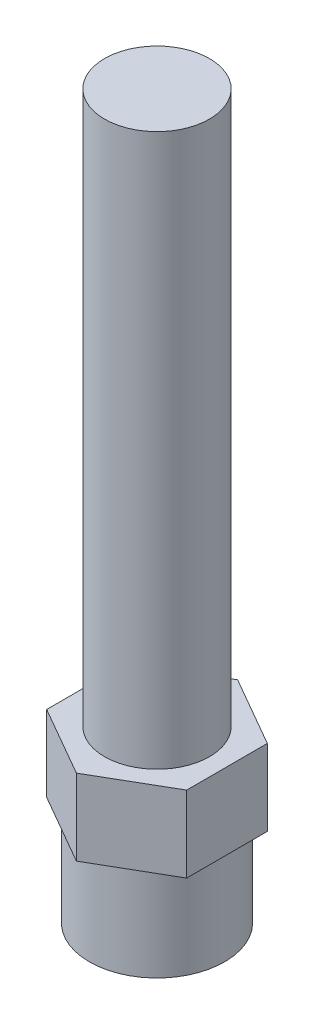
ISO-10303-21;
HEADER;
FILE_DESCRIPTION(('STEP AP214'),'2;1');
FILE_NAME('part.step','',(''),(''),'','','');
FILE_SCHEMA(('AUTOMOTIVE_DESIGN { 1 0 10303 214 1 1 1 1 }'));
ENDSEC;
DATA;
#1=APPLICATION_CONTEXT('core data for automotive mechanical design processes');
#2=APPLICATION_PROTOCOL_DEFINITION('international standard','automotive_design',2000,#1);
#3=PRODUCT_CONTEXT('',#1,'mechanical');
#4=PRODUCT('Part','Part','',(#3));
#5=PRODUCT_RELATED_PRODUCT_CATEGORY('part','',(#4));
#6=PRODUCT_DEFINITION_FORMATION('','',#4);
#7=PRODUCT_DEFINITION_CONTEXT('part definition',#1,'design');
#8=PRODUCT_DEFINITION('design','',#6,#7);
#9=PRODUCT_DEFINITION_SHAPE('','',#8);
#10=(LENGTH_UNIT() NAMED_UNIT(*) SI_UNIT(.MILLI.,.METRE.));
#11=(NAMED_UNIT(*) PLANE_ANGLE_UNIT() SI_UNIT($,.RADIAN.));
#12=(NAMED_UNIT(*) SI_UNIT($,.STERADIAN.) SOLID_ANGLE_UNIT());
#13=UNCERTAINTY_MEASURE_WITH_UNIT(LENGTH_MEASURE(1.E-05),#10,'distance_accuracy_value','');
#14=(GEOMETRIC_REPRESENTATION_CONTEXT(3) GLOBAL_UNCERTAINTY_ASSIGNED_CONTEXT((#13)) GLOBAL_UNIT_ASSIGNED_CONTEXT((#10,
#11,#12)) REPRESENTATION_CONTEXT('',''));
#15=CARTESIAN_POINT('',(0.,0.,0.));
#16=DIRECTION('',(0.,0.,1.));
#17=DIRECTION('',(1.,0.,0.));
#18=AXIS2_PLACEMENT_3D('',#15,#16,#17);
#19=CARTESIAN_POINT('',(0.,8.5,0.));
#20=DIRECTION('',(0.,-1.,0.));
#21=DIRECTION('',(0.,0.,-1.));
#22=AXIS2_PLACEMENT_3D('',#19,#20,#21);
#23=CYLINDRICAL_SURFACE('',#22,6.125);
#24=CARTESIAN_POINT('',(0.,8.5,0.));
#25=DIRECTION('',(0.,1.,0.));
#26=DIRECTION('',(0.,0.,1.));
#27=AXIS2_PLACEMENT_3D('',#24,#25,#26);
#28=CIRCLE('',#27,6.125);
#29=CARTESIAN_POINT('',(0.,8.5,6.125));
#30=VERTEX_POINT('',#29);
#31=EDGE_CURVE('E11',#30,#30,#28,.T.);
#32=ORIENTED_EDGE('',*,*,#31,.F.);
#33=EDGE_LOOP('',(#32));
#34=FACE_BOUND('',#33,.T.);
#35=CARTESIAN_POINT('',(0.,0.,0.));
#36=DIRECTION('',(0.,1.,0.));
#37=DIRECTION('',(0.,0.,1.));
#38=AXIS2_PLACEMENT_3D('',#35,#36,#37);
#39=CIRCLE('',#38,6.125);
#40=CARTESIAN_POINT('',(0.,0.,6.125));
#41=VERTEX_POINT('',#40);
#42=EDGE_CURVE('E35',#41,#41,#39,.T.);
#43=ORIENTED_EDGE('',*,*,#42,.T.);
#44=EDGE_LOOP('',(#43));
#45=FACE_BOUND('',#44,.T.);
#46=ADVANCED_FACE('F32',(#34,#45),#23,.T.);
#47=CARTESIAN_POINT('',(0.,0.,0.));
#48=DIRECTION('',(0.,1.,0.));
#49=DIRECTION('',(0.,0.,1.));
#50=AXIS2_PLACEMENT_3D('',#47,#48,#49);
#51=PLANE('',#50);
#52=ORIENTED_EDGE('',*,*,#42,.F.);
#53=EDGE_LOOP('',(#52));
#54=FACE_BOUND('',#53,.T.);
#55=ADVANCED_FACE('F141',(#54),#51,.F.);
#56=CARTESIAN_POINT('',(0.0110910701038025,15.4,7.30924599313527));
#57=DIRECTION('',(-0.501313532205408,0.,-0.865265706258914));
#58=DIRECTION('',(-0.865265706258914,0.,0.501313532205408));
#59=AXIS2_PLACEMENT_3D('',#56,#57,#58);
#60=PLANE('',#59);
#61=DIRECTION('',(0.865265706258914,0.,-0.501313532205408));
#62=VECTOR('',#61,1.);
#63=CARTESIAN_POINT('',(0.0110910701038025,8.5,7.30924599313527));
#64=LINE('',#63,#62);
#65=CARTESIAN_POINT('',(0.0110910701038025,8.5,7.30924599313527));
#66=VERTEX_POINT('',#65);
#67=CARTESIAN_POINT('',(6.33553824761666,8.5,3.64501784810258));
#68=VERTEX_POINT('',#67);
#69=EDGE_CURVE('E117',#66,#68,#64,.T.);
#70=ORIENTED_EDGE('',*,*,#69,.T.);
#71=DIRECTION('',(0.,-1.,0.));
#72=VECTOR('',#71,1.);
#73=CARTESIAN_POINT('',(6.33553824761666,15.4,3.64501784810258));
#74=LINE('',#73,#72);
#75=CARTESIAN_POINT('',(6.33553824761666,15.4,3.64501784810258));
#76=VERTEX_POINT('',#75);
#77=EDGE_CURVE('E135',#76,#68,#74,.T.);
#78=ORIENTED_EDGE('',*,*,#77,.F.);
#79=DIRECTION('',(0.865265706258914,0.,-0.501313532205408));
#80=VECTOR('',#79,1.);
#81=CARTESIAN_POINT('',(0.0110910701038025,15.4,7.30924599313527));
#82=LINE('',#81,#80);
#83=CARTESIAN_POINT('',(0.0110910701038025,15.4,7.30924599313527));
#84=VERTEX_POINT('',#83);
#85=EDGE_CURVE('E128',#84,#76,#82,.T.);
#86=ORIENTED_EDGE('',*,*,#85,.F.);
#87=DIRECTION('',(0.,-1.,0.));
#88=VECTOR('',#87,1.);
#89=CARTESIAN_POINT('',(0.0110910701038025,15.4,7.30924599313527));
#90=LINE('',#89,#88);
#91=EDGE_CURVE('E113',#84,#66,#90,.T.);
#92=ORIENTED_EDGE('',*,*,#91,.T.);
#93=EDGE_LOOP('',(#70,#78,#86,#92));
#94=FACE_BOUND('',#93,.T.);
#95=ADVANCED_FACE('F143',(#94),#60,.F.);
#96=CARTESIAN_POINT('',(6.33553824761666,15.4,3.64501784810258));
#97=DIRECTION('',(-0.999998848746407,0.,0.00151740102133469));
#98=DIRECTION('',(0.00151740102133469,0.,0.999998848746408));
#99=AXIS2_PLACEMENT_3D('',#96,#97,#98);
#100=PLANE('',#99);
#101=DIRECTION('',(-0.00151740102133469,0.,-0.999998848746408));
#102=VECTOR('',#101,1.);
#103=CARTESIAN_POINT('',(6.33553824761666,8.5,3.64501784810258));
#104=LINE('',#103,#102);
#105=CARTESIAN_POINT('',(6.32444717751286,8.5,-3.66422814503268));
#106=VERTEX_POINT('',#105);
#107=EDGE_CURVE('E120',#68,#106,#104,.T.);
#108=ORIENTED_EDGE('',*,*,#107,.T.);
#109=DIRECTION('',(0.,-1.,0.));
#110=VECTOR('',#109,1.);
#111=CARTESIAN_POINT('',(6.32444717751286,15.4,-3.66422814503268));
#112=LINE('',#111,#110);
#113=CARTESIAN_POINT('',(6.32444717751286,15.4,-3.66422814503268));
#114=VERTEX_POINT('',#113);
#115=EDGE_CURVE('E132',#114,#106,#112,.T.);
#116=ORIENTED_EDGE('',*,*,#115,.F.);
#117=DIRECTION('',(-0.00151740102133469,0.,-0.999998848746408));
#118=VECTOR('',#117,1.);
#119=CARTESIAN_POINT('',(6.33553824761666,15.4,3.64501784810258));
#120=LINE('',#119,#118);
#121=EDGE_CURVE('E86',#76,#114,#120,.T.);
#122=ORIENTED_EDGE('',*,*,#121,.F.);
#123=ORIENTED_EDGE('',*,*,#77,.T.);
#124=EDGE_LOOP('',(#108,#116,#122,#123));
#125=FACE_BOUND('',#124,.T.);
#126=ADVANCED_FACE('F148',(#125),#100,.F.);
#127=CARTESIAN_POINT('',(6.32444717751286,15.4,-3.66422814503268));
#128=DIRECTION('',(-0.498685316540999,0.,0.866783107280249));
#129=DIRECTION('',(0.866783107280249,0.,0.498685316540999));
#130=AXIS2_PLACEMENT_3D('',#127,#128,#129);
#131=PLANE('',#130);
#132=DIRECTION('',(-0.866783107280249,0.,-0.498685316540999));
#133=VECTOR('',#132,1.);
#134=CARTESIAN_POINT('',(6.32444717751286,8.5,-3.66422814503268));
#135=LINE('',#134,#133);
#136=CARTESIAN_POINT('',(-0.0110910701038051,8.5,-7.30924599313527));
#137=VERTEX_POINT('',#136);
#138=EDGE_CURVE('E123',#106,#137,#135,.T.);
#139=ORIENTED_EDGE('',*,*,#138,.T.);
#140=DIRECTION('',(0.,-1.,0.));
#141=VECTOR('',#140,1.);
#142=CARTESIAN_POINT('',(-0.0110910701038051,15.4,-7.30924599313527));
#143=LINE('',#142,#141);
#144=CARTESIAN_POINT('',(-0.0110910701038051,15.4,-7.30924599313527));
#145=VERTEX_POINT('',#144);
#146=EDGE_CURVE('E108',#145,#137,#143,.T.);
#147=ORIENTED_EDGE('',*,*,#146,.F.);
#148=DIRECTION('',(-0.866783107280249,0.,-0.498685316540999));
#149=VECTOR('',#148,1.);
#150=CARTESIAN_POINT('',(6.32444717751286,15.4,-3.66422814503268));
#151=LINE('',#150,#149);
#152=EDGE_CURVE('E99',#114,#145,#151,.T.);
#153=ORIENTED_EDGE('',*,*,#152,.F.);
#154=ORIENTED_EDGE('',*,*,#115,.T.);
#155=EDGE_LOOP('',(#139,#147,#153,#154));
#156=FACE_BOUND('',#155,.T.);
#157=ADVANCED_FACE('F155',(#156),#131,.F.);
#158=CARTESIAN_POINT('',(-0.0110910701038051,15.4,-7.30924599313527));
#159=DIRECTION('',(0.501313532205408,0.,0.865265706258914));
#160=DIRECTION('',(0.865265706258914,0.,-0.501313532205408));
#161=AXIS2_PLACEMENT_3D('',#158,#159,#160);
#162=PLANE('',#161);
#163=DIRECTION('',(-0.865265706258914,0.,0.501313532205408));
#164=VECTOR('',#163,1.);
#165=CARTESIAN_POINT('',(-0.0110910701038051,8.5,-7.30924599313527));
#166=LINE('',#165,#164);
#167=CARTESIAN_POINT('',(-6.33553824761666,8.5,-3.64501784810258));
#168=VERTEX_POINT('',#167);
#169=EDGE_CURVE('E107',#137,#168,#166,.T.);
#170=ORIENTED_EDGE('',*,*,#169,.T.);
#171=DIRECTION('',(0.,-1.,0.));
#172=VECTOR('',#171,1.);
#173=CARTESIAN_POINT('',(-6.33553824761666,15.4,-3.64501784810258));
#174=LINE('',#173,#172);
#175=CARTESIAN_POINT('',(-6.33553824761666,15.4,-3.64501784810258));
#176=VERTEX_POINT('',#175);
#177=EDGE_CURVE('E104',#176,#168,#174,.T.);
#178=ORIENTED_EDGE('',*,*,#177,.F.);
#179=DIRECTION('',(-0.865265706258914,0.,0.501313532205408));
#180=VECTOR('',#179,1.);
#181=CARTESIAN_POINT('',(-0.0110910701038051,15.4,-7.30924599313527));
#182=LINE('',#181,#180);
#183=EDGE_CURVE('E93',#145,#176,#182,.T.);
#184=ORIENTED_EDGE('',*,*,#183,.F.);
#185=ORIENTED_EDGE('',*,*,#146,.T.);
#186=EDGE_LOOP('',(#170,#178,#184,#185));
#187=FACE_BOUND('',#186,.T.);
#188=ADVANCED_FACE('F105',(#187),#162,.F.);
#189=CARTESIAN_POINT('',(-6.33553824761666,15.4,-3.64501784810258));
#190=DIRECTION('',(0.999998848746407,0.,-0.00151740102133469));
#191=DIRECTION('',(-0.00151740102133469,0.,-0.999998848746408));
#192=AXIS2_PLACEMENT_3D('',#189,#190,#191);
#193=PLANE('',#192);
#194=DIRECTION('',(0.00151740102133469,0.,0.999998848746407));
#195=VECTOR('',#194,1.);
#196=CARTESIAN_POINT('',(-6.33553824761666,8.5,-3.64501784810258));
#197=LINE('',#196,#195);
#198=CARTESIAN_POINT('',(-6.32444717751286,8.5,3.66422814503268));
#199=VERTEX_POINT('',#198);
#200=EDGE_CURVE('E71',#168,#199,#197,.T.);
#201=ORIENTED_EDGE('',*,*,#200,.T.);
#202=DIRECTION('',(0.,-1.,0.));
#203=VECTOR('',#202,1.);
#204=CARTESIAN_POINT('',(-6.32444717751286,15.4,3.66422814503268));
#205=LINE('',#204,#203);
#206=CARTESIAN_POINT('',(-6.32444717751286,15.4,3.66422814503268));
#207=VERTEX_POINT('',#206);
#208=EDGE_CURVE('E109',#207,#199,#205,.T.);
#209=ORIENTED_EDGE('',*,*,#208,.F.);
#210=DIRECTION('',(0.00151740102133469,0.,0.999998848746407));
#211=VECTOR('',#210,1.);
#212=CARTESIAN_POINT('',(-6.33553824761666,15.4,-3.64501784810258));
#213=LINE('',#212,#211);
#214=EDGE_CURVE('E97',#176,#207,#213,.T.);
#215=ORIENTED_EDGE('',*,*,#214,.F.);
#216=ORIENTED_EDGE('',*,*,#177,.T.);
#217=EDGE_LOOP('',(#201,#209,#215,#216));
#218=FACE_BOUND('',#217,.T.);
#219=ADVANCED_FACE('F111',(#218),#193,.F.);
#220=CARTESIAN_POINT('',(-6.32444717751286,15.4,3.66422814503268));
#221=DIRECTION('',(0.498685316541,0.,-0.866783107280249));
#222=DIRECTION('',(-0.866783107280249,0.,-0.498685316541));
#223=AXIS2_PLACEMENT_3D('',#220,#221,#222);
#224=PLANE('',#223);
#225=DIRECTION('',(0.866783107280249,0.,0.498685316541));
#226=VECTOR('',#225,1.);
#227=CARTESIAN_POINT('',(-6.32444717751286,8.5,3.66422814503268));
#228=LINE('',#227,#226);
#229=EDGE_CURVE('E77',#199,#66,#228,.T.);
#230=ORIENTED_EDGE('',*,*,#229,.T.);
#231=ORIENTED_EDGE('',*,*,#91,.F.);
#232=DIRECTION('',(0.866783107280249,0.,0.498685316541));
#233=VECTOR('',#232,1.);
#234=CARTESIAN_POINT('',(-6.32444717751286,15.4,3.66422814503268));
#235=LINE('',#234,#233);
#236=EDGE_CURVE('E48',#207,#84,#235,.T.);
#237=ORIENTED_EDGE('',*,*,#236,.F.);
#238=ORIENTED_EDGE('',*,*,#208,.T.);
#239=EDGE_LOOP('',(#230,#231,#237,#238));
#240=FACE_BOUND('',#239,.T.);
#241=ADVANCED_FACE('F163',(#240),#224,.F.);
#242=CARTESIAN_POINT('',(0.,15.4,0.));
#243=DIRECTION('',(0.,1.,0.));
#244=DIRECTION('',(0.,0.,1.));
#245=AXIS2_PLACEMENT_3D('',#242,#243,#244);
#246=PLANE('',#245);
#247=CARTESIAN_POINT('',(0.,15.4,0.));
#248=DIRECTION('',(0.,1.,0.));
#249=DIRECTION('',(0.,0.,1.));
#250=AXIS2_PLACEMENT_3D('',#247,#248,#249);
#251=CIRCLE('',#250,4.75);
#252=CARTESIAN_POINT('',(0.,15.4,4.75));
#253=VERTEX_POINT('',#252);
#254=EDGE_CURVE('E184',#253,#253,#251,.T.);
#255=ORIENTED_EDGE('',*,*,#254,.F.);
#256=EDGE_LOOP('',(#255));
#257=FACE_BOUND('',#256,.T.);
#258=ORIENTED_EDGE('',*,*,#85,.T.);
#259=ORIENTED_EDGE('',*,*,#121,.T.);
#260=ORIENTED_EDGE('',*,*,#152,.T.);
#261=ORIENTED_EDGE('',*,*,#183,.T.);
#262=ORIENTED_EDGE('',*,*,#214,.T.);
#263=ORIENTED_EDGE('',*,*,#236,.T.);
#264=EDGE_LOOP('',(#258,#259,#260,#261,#262,#263));
#265=FACE_BOUND('',#264,.T.);
#266=ADVANCED_FACE('F95',(#257,#265),#246,.T.);
#267=CARTESIAN_POINT('',(0.,8.5,0.));
#268=DIRECTION('',(0.,1.,0.));
#269=DIRECTION('',(0.,0.,1.));
#270=AXIS2_PLACEMENT_3D('',#267,#268,#269);
#271=PLANE('',#270);
#272=ORIENTED_EDGE('',*,*,#31,.T.);
#273=EDGE_LOOP('',(#272));
#274=FACE_BOUND('',#273,.T.);
#275=ORIENTED_EDGE('',*,*,#69,.F.);
#276=ORIENTED_EDGE('',*,*,#229,.F.);
#277=ORIENTED_EDGE('',*,*,#200,.F.);
#278=ORIENTED_EDGE('',*,*,#169,.F.);
#279=ORIENTED_EDGE('',*,*,#138,.F.);
#280=ORIENTED_EDGE('',*,*,#107,.F.);
#281=EDGE_LOOP('',(#275,#276,#277,#278,#279,#280));
#282=FACE_BOUND('',#281,.T.);
#283=ADVANCED_FACE('F166',(#274,#282),#271,.F.);
#284=CARTESIAN_POINT('',(0.,65.4,0.));
#285=DIRECTION('',(0.,-1.,0.));
#286=DIRECTION('',(0.,0.,-1.));
#287=AXIS2_PLACEMENT_3D('',#284,#285,#286);
#288=CYLINDRICAL_SURFACE('',#287,4.75);
#289=CARTESIAN_POINT('',(0.,65.4,0.));
#290=DIRECTION('',(0.,1.,0.));
#291=DIRECTION('',(0.,0.,1.));
#292=AXIS2_PLACEMENT_3D('',#289,#290,#291);
#293=CIRCLE('',#292,4.75);
#294=CARTESIAN_POINT('',(0.,65.4,4.75));
#295=VERTEX_POINT('',#294);
#296=EDGE_CURVE('E121',#295,#295,#293,.T.);
#297=ORIENTED_EDGE('',*,*,#296,.F.);
#298=EDGE_LOOP('',(#297));
#299=FACE_BOUND('',#298,.T.);
#300=ORIENTED_EDGE('',*,*,#254,.T.);
#301=EDGE_LOOP('',(#300));
#302=FACE_BOUND('',#301,.T.);
#303=ADVANCED_FACE('F169',(#299,#302),#288,.T.);
#304=CARTESIAN_POINT('',(0.,65.4,0.));
#305=DIRECTION('',(0.,1.,0.));
#306=DIRECTION('',(0.,0.,1.));
#307=AXIS2_PLACEMENT_3D('',#304,#305,#306);
#308=PLANE('',#307);
#309=ORIENTED_EDGE('',*,*,#296,.T.);
#310=EDGE_LOOP('',(#309));
#311=FACE_BOUND('',#310,.T.);
#312=ADVANCED_FACE('F176',(#311),#308,.T.);
#313=CLOSED_SHELL('',(#46,#55,#95,#126,#157,#188,#219,#241,#266,#283,#303,#312));
#314=MANIFOLD_SOLID_BREP('B2',#313);
#315=ADVANCED_BREP_SHAPE_REPRESENTATION('',(#18,#314),#14);
#316=SHAPE_DEFINITION_REPRESENTATION(#9,#315);
ENDSEC;
END-ISO-10303-21;
